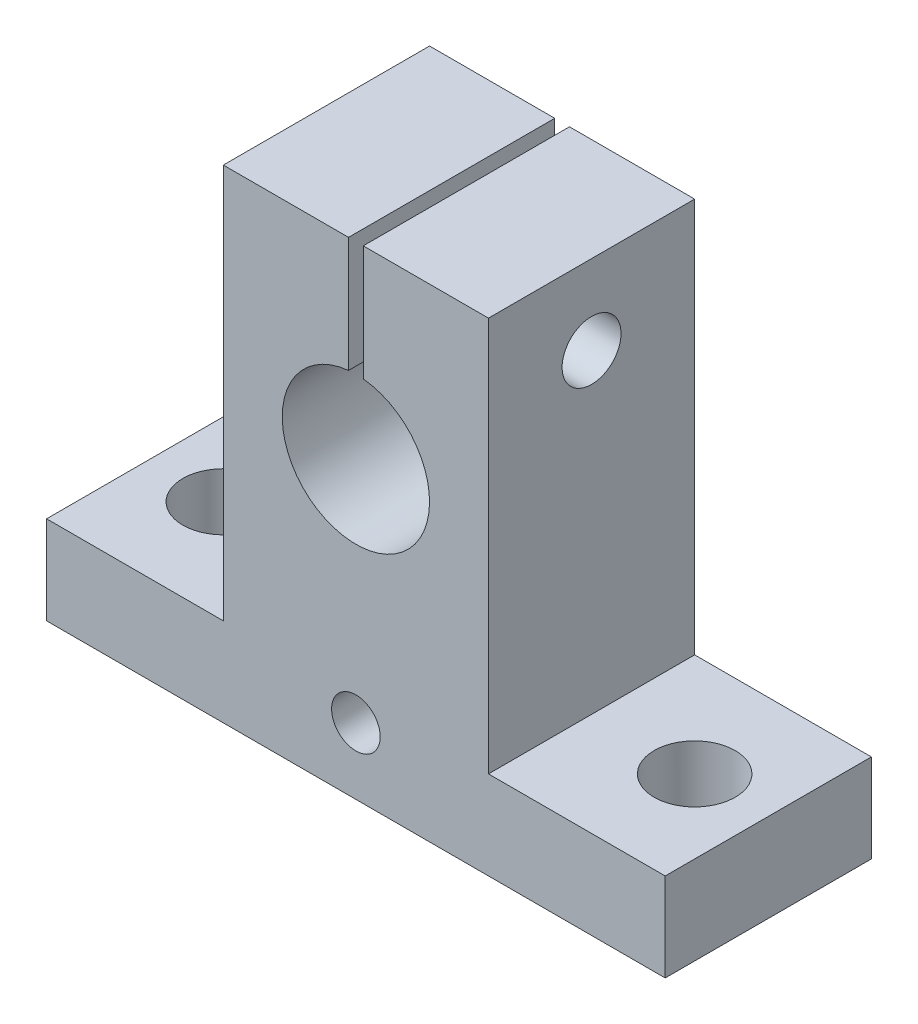
ISO-10303-21;
HEADER;
FILE_DESCRIPTION(('STEP AP214'),'2;1');
FILE_NAME('part.step','',(''),(''),'','','');
FILE_SCHEMA(('AUTOMOTIVE_DESIGN { 1 0 10303 214 1 1 1 1 }'));
ENDSEC;
DATA;
#1=APPLICATION_CONTEXT('core data for automotive mechanical design processes');
#2=APPLICATION_PROTOCOL_DEFINITION('international standard','automotive_design',2000,#1);
#3=PRODUCT_CONTEXT('',#1,'mechanical');
#4=PRODUCT('Part','Part','',(#3));
#5=PRODUCT_RELATED_PRODUCT_CATEGORY('part','',(#4));
#6=PRODUCT_DEFINITION_FORMATION('','',#4);
#7=PRODUCT_DEFINITION_CONTEXT('part definition',#1,'design');
#8=PRODUCT_DEFINITION('design','',#6,#7);
#9=PRODUCT_DEFINITION_SHAPE('','',#8);
#10=(LENGTH_UNIT() NAMED_UNIT(*) SI_UNIT(.MILLI.,.METRE.));
#11=(NAMED_UNIT(*) PLANE_ANGLE_UNIT() SI_UNIT($,.RADIAN.));
#12=(NAMED_UNIT(*) SI_UNIT($,.STERADIAN.) SOLID_ANGLE_UNIT());
#13=UNCERTAINTY_MEASURE_WITH_UNIT(LENGTH_MEASURE(1.E-05),#10,'distance_accuracy_value','');
#14=(GEOMETRIC_REPRESENTATION_CONTEXT(3) GLOBAL_UNCERTAINTY_ASSIGNED_CONTEXT((#13)) GLOBAL_UNIT_ASSIGNED_CONTEXT((#10,
#11,#12)) REPRESENTATION_CONTEXT('',''));
#15=CARTESIAN_POINT('',(0.,0.,0.));
#16=DIRECTION('',(0.,0.,1.));
#17=DIRECTION('',(1.,0.,0.));
#18=AXIS2_PLACEMENT_3D('',#15,#16,#17);
#19=CARTESIAN_POINT('',(-9.,13.4,7.));
#20=DIRECTION('',(0.,-1.,0.));
#21=DIRECTION('',(1.,0.,0.));
#22=AXIS2_PLACEMENT_3D('',#19,#20,#21);
#23=PLANE('',#22);
#24=DIRECTION('',(-1.,0.,0.));
#25=VECTOR('',#24,1.);
#26=CARTESIAN_POINT('',(-9.,13.4,7.));
#27=LINE('',#26,#25);
#28=CARTESIAN_POINT('',(-0.500000000000003,13.4,7.));
#29=VERTEX_POINT('',#28);
#30=CARTESIAN_POINT('',(-9.,13.4,7.));
#31=VERTEX_POINT('',#30);
#32=EDGE_CURVE('E218',#29,#31,#27,.T.);
#33=ORIENTED_EDGE('',*,*,#32,.F.);
#34=DIRECTION('',(0.,0.,-1.));
#35=VECTOR('',#34,1.);
#36=CARTESIAN_POINT('',(-0.500000000000002,13.4,7.));
#37=LINE('',#36,#35);
#38=CARTESIAN_POINT('',(-0.500000000000003,13.4,-7.));
#39=VERTEX_POINT('',#38);
#40=EDGE_CURVE('E133',#29,#39,#37,.T.);
#41=ORIENTED_EDGE('',*,*,#40,.T.);
#42=DIRECTION('',(-1.,0.,0.));
#43=VECTOR('',#42,1.);
#44=CARTESIAN_POINT('',(-9.,13.4,-7.));
#45=LINE('',#44,#43);
#46=CARTESIAN_POINT('',(-9.,13.4,-7.));
#47=VERTEX_POINT('',#46);
#48=EDGE_CURVE('E150',#39,#47,#45,.T.);
#49=ORIENTED_EDGE('',*,*,#48,.T.);
#50=DIRECTION('',(0.,0.,-1.));
#51=VECTOR('',#50,1.);
#52=CARTESIAN_POINT('',(-9.,13.4,7.));
#53=LINE('',#52,#51);
#54=EDGE_CURVE('E182',#31,#47,#53,.T.);
#55=ORIENTED_EDGE('',*,*,#54,.F.);
#56=EDGE_LOOP('',(#33,#41,#49,#55));
#57=FACE_BOUND('',#56,.T.);
#58=ADVANCED_FACE('F38',(#57),#23,.F.);
#59=CARTESIAN_POINT('',(0.,0.,7.));
#60=DIRECTION('',(0.,0.,-1.));
#61=DIRECTION('',(-1.,0.,0.));
#62=AXIS2_PLACEMENT_3D('',#59,#60,#61);
#63=PLANE('',#62);
#64=CARTESIAN_POINT('',(0.,-14.9,7.));
#65=DIRECTION('',(0.,0.,1.));
#66=DIRECTION('',(1.,0.,0.));
#67=AXIS2_PLACEMENT_3D('',#64,#65,#66);
#68=CIRCLE('',#67,1.64999999999999);
#69=CARTESIAN_POINT('',(1.64999999999999,-14.9,7.));
#70=VERTEX_POINT('',#69);
#71=EDGE_CURVE('E280',#70,#70,#68,.T.);
#72=ORIENTED_EDGE('',*,*,#71,.F.);
#73=EDGE_LOOP('',(#72));
#74=FACE_BOUND('',#73,.T.);
#75=CARTESIAN_POINT('',(0.,0.6,7.));
#76=DIRECTION('',(0.,0.,1.));
#77=DIRECTION('',(1.,0.,0.));
#78=AXIS2_PLACEMENT_3D('',#75,#76,#77);
#79=CIRCLE('',#78,5.);
#80=CARTESIAN_POINT('',(-0.500000000000001,5.5749371855331,7.));
#81=VERTEX_POINT('',#80);
#82=CARTESIAN_POINT('',(0.499999999999999,5.5749371855331,7.));
#83=VERTEX_POINT('',#82);
#84=EDGE_CURVE('E202',#81,#83,#79,.T.);
#85=ORIENTED_EDGE('',*,*,#84,.F.);
#86=DIRECTION('',(0.,-1.,0.));
#87=VECTOR('',#86,1.);
#88=CARTESIAN_POINT('',(-0.500000000000004,16.5999271851901,7.));
#89=LINE('',#88,#87);
#90=EDGE_CURVE('E61',#29,#81,#89,.T.);
#91=ORIENTED_EDGE('',*,*,#90,.F.);
#92=ORIENTED_EDGE('',*,*,#32,.T.);
#93=DIRECTION('',(0.,-1.,0.));
#94=VECTOR('',#93,1.);
#95=CARTESIAN_POINT('',(-9.,13.4,7.));
#96=LINE('',#95,#94);
#97=CARTESIAN_POINT('',(-9.,-13.4,7.));
#98=VERTEX_POINT('',#97);
#99=EDGE_CURVE('E220',#31,#98,#96,.T.);
#100=ORIENTED_EDGE('',*,*,#99,.T.);
#101=DIRECTION('',(-1.,0.,0.));
#102=VECTOR('',#101,1.);
#103=CARTESIAN_POINT('',(-9.,-13.4,7.));
#104=LINE('',#103,#102);
#105=CARTESIAN_POINT('',(-21.,-13.4,7.));
#106=VERTEX_POINT('',#105);
#107=EDGE_CURVE('E222',#98,#106,#104,.T.);
#108=ORIENTED_EDGE('',*,*,#107,.T.);
#109=DIRECTION('',(0.,-1.,0.));
#110=VECTOR('',#109,1.);
#111=CARTESIAN_POINT('',(-21.,-13.4,7.));
#112=LINE('',#111,#110);
#113=CARTESIAN_POINT('',(-21.,-19.4,7.));
#114=VERTEX_POINT('',#113);
#115=EDGE_CURVE('E224',#106,#114,#112,.T.);
#116=ORIENTED_EDGE('',*,*,#115,.T.);
#117=DIRECTION('',(1.,0.,0.));
#118=VECTOR('',#117,1.);
#119=CARTESIAN_POINT('',(-21.,-19.4,7.));
#120=LINE('',#119,#118);
#121=CARTESIAN_POINT('',(21.,-19.4,7.));
#122=VERTEX_POINT('',#121);
#123=EDGE_CURVE('E226',#114,#122,#120,.T.);
#124=ORIENTED_EDGE('',*,*,#123,.T.);
#125=DIRECTION('',(0.,1.,0.));
#126=VECTOR('',#125,1.);
#127=CARTESIAN_POINT('',(21.,-13.4,7.));
#128=LINE('',#127,#126);
#129=CARTESIAN_POINT('',(21.,-13.4,7.));
#130=VERTEX_POINT('',#129);
#131=EDGE_CURVE('E170',#122,#130,#128,.T.);
#132=ORIENTED_EDGE('',*,*,#131,.T.);
#133=DIRECTION('',(-1.,0.,0.));
#134=VECTOR('',#133,1.);
#135=CARTESIAN_POINT('',(9.,-13.4,7.));
#136=LINE('',#135,#134);
#137=CARTESIAN_POINT('',(9.,-13.4,7.));
#138=VERTEX_POINT('',#137);
#139=EDGE_CURVE('E165',#130,#138,#136,.T.);
#140=ORIENTED_EDGE('',*,*,#139,.T.);
#141=DIRECTION('',(0.,1.,0.));
#142=VECTOR('',#141,1.);
#143=CARTESIAN_POINT('',(9.,13.4,7.));
#144=LINE('',#143,#142);
#145=CARTESIAN_POINT('',(9.,13.4,7.));
#146=VERTEX_POINT('',#145);
#147=EDGE_CURVE('E216',#138,#146,#144,.T.);
#148=ORIENTED_EDGE('',*,*,#147,.T.);
#149=CARTESIAN_POINT('',(0.499999999999997,13.4,7.));
#150=VERTEX_POINT('',#149);
#151=EDGE_CURVE('E203',#146,#150,#27,.T.);
#152=ORIENTED_EDGE('',*,*,#151,.T.);
#153=DIRECTION('',(0.,1.,0.));
#154=VECTOR('',#153,1.);
#155=CARTESIAN_POINT('',(0.499999999999996,16.5999271851901,7.));
#156=LINE('',#155,#154);
#157=EDGE_CURVE('E128',#83,#150,#156,.T.);
#158=ORIENTED_EDGE('',*,*,#157,.F.);
#159=EDGE_LOOP('',(#85,#91,#92,#100,#108,#116,#124,#132,#140,#148,#152,#158));
#160=FACE_BOUND('',#159,.T.);
#161=ADVANCED_FACE('F201',(#74,#160),#63,.F.);
#162=CARTESIAN_POINT('',(0.,0.,-7.));
#163=DIRECTION('',(0.,0.,-1.));
#164=DIRECTION('',(-1.,0.,0.));
#165=AXIS2_PLACEMENT_3D('',#162,#163,#164);
#166=PLANE('',#165);
#167=CARTESIAN_POINT('',(0.,-14.9,-7.));
#168=DIRECTION('',(0.,0.,1.));
#169=DIRECTION('',(1.,0.,0.));
#170=AXIS2_PLACEMENT_3D('',#167,#168,#169);
#171=CIRCLE('',#170,1.64999999999999);
#172=CARTESIAN_POINT('',(1.64999999999999,-14.9,-7.));
#173=VERTEX_POINT('',#172);
#174=EDGE_CURVE('E277',#173,#173,#171,.T.);
#175=ORIENTED_EDGE('',*,*,#174,.T.);
#176=EDGE_LOOP('',(#175));
#177=FACE_BOUND('',#176,.T.);
#178=DIRECTION('',(0.,-1.,0.));
#179=VECTOR('',#178,1.);
#180=CARTESIAN_POINT('',(-0.500000000000004,16.5999271851901,-7.));
#181=LINE('',#180,#179);
#182=CARTESIAN_POINT('',(-0.500000000000001,5.5749371855331,-7.));
#183=VERTEX_POINT('',#182);
#184=EDGE_CURVE('E143',#39,#183,#181,.T.);
#185=ORIENTED_EDGE('',*,*,#184,.T.);
#186=CARTESIAN_POINT('',(0.,0.6,-7.));
#187=DIRECTION('',(0.,0.,1.));
#188=DIRECTION('',(1.,0.,0.));
#189=AXIS2_PLACEMENT_3D('',#186,#187,#188);
#190=CIRCLE('',#189,5.);
#191=CARTESIAN_POINT('',(0.499999999999999,5.5749371855331,-7.));
#192=VERTEX_POINT('',#191);
#193=EDGE_CURVE('E142',#183,#192,#190,.T.);
#194=ORIENTED_EDGE('',*,*,#193,.T.);
#195=DIRECTION('',(0.,1.,0.));
#196=VECTOR('',#195,1.);
#197=CARTESIAN_POINT('',(0.499999999999996,16.5999271851901,-7.));
#198=LINE('',#197,#196);
#199=CARTESIAN_POINT('',(0.499999999999997,13.4,-7.));
#200=VERTEX_POINT('',#199);
#201=EDGE_CURVE('E54',#192,#200,#198,.T.);
#202=ORIENTED_EDGE('',*,*,#201,.T.);
#203=CARTESIAN_POINT('',(9.,13.4,-7.));
#204=VERTEX_POINT('',#203);
#205=EDGE_CURVE('E140',#204,#200,#45,.T.);
#206=ORIENTED_EDGE('',*,*,#205,.F.);
#207=DIRECTION('',(0.,1.,0.));
#208=VECTOR('',#207,1.);
#209=CARTESIAN_POINT('',(9.,13.4,-7.));
#210=LINE('',#209,#208);
#211=CARTESIAN_POINT('',(9.,-13.4,-7.));
#212=VERTEX_POINT('',#211);
#213=EDGE_CURVE('E154',#212,#204,#210,.T.);
#214=ORIENTED_EDGE('',*,*,#213,.F.);
#215=DIRECTION('',(-1.,0.,0.));
#216=VECTOR('',#215,1.);
#217=CARTESIAN_POINT('',(9.,-13.4,-7.));
#218=LINE('',#217,#216);
#219=CARTESIAN_POINT('',(21.,-13.4,-7.));
#220=VERTEX_POINT('',#219);
#221=EDGE_CURVE('E207',#220,#212,#218,.T.);
#222=ORIENTED_EDGE('',*,*,#221,.F.);
#223=DIRECTION('',(0.,1.,0.));
#224=VECTOR('',#223,1.);
#225=CARTESIAN_POINT('',(21.,-13.4,-7.));
#226=LINE('',#225,#224);
#227=CARTESIAN_POINT('',(21.,-19.4,-7.));
#228=VERTEX_POINT('',#227);
#229=EDGE_CURVE('E163',#228,#220,#226,.T.);
#230=ORIENTED_EDGE('',*,*,#229,.F.);
#231=DIRECTION('',(1.,0.,0.));
#232=VECTOR('',#231,1.);
#233=CARTESIAN_POINT('',(-21.,-19.4,-7.));
#234=LINE('',#233,#232);
#235=CARTESIAN_POINT('',(-21.,-19.4,-7.));
#236=VERTEX_POINT('',#235);
#237=EDGE_CURVE('E161',#236,#228,#234,.T.);
#238=ORIENTED_EDGE('',*,*,#237,.F.);
#239=DIRECTION('',(0.,-1.,0.));
#240=VECTOR('',#239,1.);
#241=CARTESIAN_POINT('',(-21.,-13.4,-7.));
#242=LINE('',#241,#240);
#243=CARTESIAN_POINT('',(-21.,-13.4,-7.));
#244=VERTEX_POINT('',#243);
#245=EDGE_CURVE('E159',#244,#236,#242,.T.);
#246=ORIENTED_EDGE('',*,*,#245,.F.);
#247=DIRECTION('',(-1.,0.,0.));
#248=VECTOR('',#247,1.);
#249=CARTESIAN_POINT('',(-9.,-13.4,-7.));
#250=LINE('',#249,#248);
#251=CARTESIAN_POINT('',(-9.,-13.4,-7.));
#252=VERTEX_POINT('',#251);
#253=EDGE_CURVE('E152',#252,#244,#250,.T.);
#254=ORIENTED_EDGE('',*,*,#253,.F.);
#255=DIRECTION('',(0.,-1.,0.));
#256=VECTOR('',#255,1.);
#257=CARTESIAN_POINT('',(-9.,13.4,-7.));
#258=LINE('',#257,#256);
#259=EDGE_CURVE('E149',#47,#252,#258,.T.);
#260=ORIENTED_EDGE('',*,*,#259,.F.);
#261=ORIENTED_EDGE('',*,*,#48,.F.);
#262=EDGE_LOOP('',(#185,#194,#202,#206,#214,#222,#230,#238,#246,#254,#260,#261));
#263=FACE_BOUND('',#262,.T.);
#264=ADVANCED_FACE('F139',(#177,#263),#166,.T.);
#265=CARTESIAN_POINT('',(9.,-13.4,7.));
#266=DIRECTION('',(0.,-1.,0.));
#267=DIRECTION('',(1.,0.,0.));
#268=AXIS2_PLACEMENT_3D('',#265,#266,#267);
#269=PLANE('',#268);
#270=CARTESIAN_POINT('',(16.,-13.4,0.));
#271=DIRECTION('',(0.,1.,0.));
#272=DIRECTION('',(0.,0.,-1.));
#273=AXIS2_PLACEMENT_3D('',#270,#271,#272);
#274=CIRCLE('',#273,2.75);
#275=CARTESIAN_POINT('',(16.,-13.4,-2.75));
#276=VERTEX_POINT('',#275);
#277=EDGE_CURVE('E196',#276,#276,#274,.T.);
#278=ORIENTED_EDGE('',*,*,#277,.F.);
#279=EDGE_LOOP('',(#278));
#280=FACE_BOUND('',#279,.T.);
#281=ORIENTED_EDGE('',*,*,#221,.T.);
#282=DIRECTION('',(0.,0.,-1.));
#283=VECTOR('',#282,1.);
#284=CARTESIAN_POINT('',(9.,-13.4,7.));
#285=LINE('',#284,#283);
#286=EDGE_CURVE('E186',#138,#212,#285,.T.);
#287=ORIENTED_EDGE('',*,*,#286,.F.);
#288=ORIENTED_EDGE('',*,*,#139,.F.);
#289=DIRECTION('',(0.,0.,-1.));
#290=VECTOR('',#289,1.);
#291=CARTESIAN_POINT('',(21.,-13.4,7.));
#292=LINE('',#291,#290);
#293=EDGE_CURVE('E166',#130,#220,#292,.T.);
#294=ORIENTED_EDGE('',*,*,#293,.T.);
#295=EDGE_LOOP('',(#281,#287,#288,#294));
#296=FACE_BOUND('',#295,.T.);
#297=ADVANCED_FACE('F40',(#280,#296),#269,.F.);
#298=CARTESIAN_POINT('',(9.,13.4,7.));
#299=DIRECTION('',(-1.,0.,0.));
#300=DIRECTION('',(0.,-1.,0.));
#301=AXIS2_PLACEMENT_3D('',#298,#299,#300);
#302=PLANE('',#301);
#303=CARTESIAN_POINT('',(9.,8.,0.));
#304=DIRECTION('',(1.,0.,0.));
#305=DIRECTION('',(0.,1.,0.));
#306=AXIS2_PLACEMENT_3D('',#303,#304,#305);
#307=CIRCLE('',#306,2.);
#308=CARTESIAN_POINT('',(9.,10.,0.));
#309=VERTEX_POINT('',#308);
#310=EDGE_CURVE('E274',#309,#309,#307,.T.);
#311=ORIENTED_EDGE('',*,*,#310,.F.);
#312=EDGE_LOOP('',(#311));
#313=FACE_BOUND('',#312,.T.);
#314=ORIENTED_EDGE('',*,*,#213,.T.);
#315=DIRECTION('',(0.,0.,-1.));
#316=VECTOR('',#315,1.);
#317=CARTESIAN_POINT('',(9.,13.4,7.));
#318=LINE('',#317,#316);
#319=EDGE_CURVE('E148',#146,#204,#318,.T.);
#320=ORIENTED_EDGE('',*,*,#319,.F.);
#321=ORIENTED_EDGE('',*,*,#147,.F.);
#322=ORIENTED_EDGE('',*,*,#286,.T.);
#323=EDGE_LOOP('',(#314,#320,#321,#322));
#324=FACE_BOUND('',#323,.T.);
#325=ADVANCED_FACE('F240',(#313,#324),#302,.F.);
#326=ORIENTED_EDGE('',*,*,#205,.T.);
#327=DIRECTION('',(0.,0.,1.));
#328=VECTOR('',#327,1.);
#329=CARTESIAN_POINT('',(0.499999999999997,13.4,7.));
#330=LINE('',#329,#328);
#331=EDGE_CURVE('E125',#200,#150,#330,.T.);
#332=ORIENTED_EDGE('',*,*,#331,.T.);
#333=ORIENTED_EDGE('',*,*,#151,.F.);
#334=ORIENTED_EDGE('',*,*,#319,.T.);
#335=EDGE_LOOP('',(#326,#332,#333,#334));
#336=FACE_BOUND('',#335,.T.);
#337=ADVANCED_FACE('F146',(#336),#23,.F.);
#338=CARTESIAN_POINT('',(-9.,13.4,7.));
#339=DIRECTION('',(1.,0.,0.));
#340=DIRECTION('',(0.,1.,0.));
#341=AXIS2_PLACEMENT_3D('',#338,#339,#340);
#342=PLANE('',#341);
#343=CARTESIAN_POINT('',(-9.,8.,0.));
#344=DIRECTION('',(1.,0.,0.));
#345=DIRECTION('',(0.,1.,0.));
#346=AXIS2_PLACEMENT_3D('',#343,#344,#345);
#347=CIRCLE('',#346,2.);
#348=CARTESIAN_POINT('',(-9.,10.,0.));
#349=VERTEX_POINT('',#348);
#350=EDGE_CURVE('E204',#349,#349,#347,.T.);
#351=ORIENTED_EDGE('',*,*,#350,.T.);
#352=EDGE_LOOP('',(#351));
#353=FACE_BOUND('',#352,.T.);
#354=ORIENTED_EDGE('',*,*,#259,.T.);
#355=DIRECTION('',(0.,0.,-1.));
#356=VECTOR('',#355,1.);
#357=CARTESIAN_POINT('',(-9.,-13.4,7.));
#358=LINE('',#357,#356);
#359=EDGE_CURVE('E179',#98,#252,#358,.T.);
#360=ORIENTED_EDGE('',*,*,#359,.F.);
#361=ORIENTED_EDGE('',*,*,#99,.F.);
#362=ORIENTED_EDGE('',*,*,#54,.T.);
#363=EDGE_LOOP('',(#354,#360,#361,#362));
#364=FACE_BOUND('',#363,.T.);
#365=ADVANCED_FACE('F258',(#353,#364),#342,.F.);
#366=CARTESIAN_POINT('',(-9.,-13.4,7.));
#367=DIRECTION('',(0.,-1.,0.));
#368=DIRECTION('',(1.,0.,0.));
#369=AXIS2_PLACEMENT_3D('',#366,#367,#368);
#370=PLANE('',#369);
#371=CARTESIAN_POINT('',(-16.,-13.4,0.));
#372=DIRECTION('',(0.,1.,0.));
#373=DIRECTION('',(0.,0.,1.));
#374=AXIS2_PLACEMENT_3D('',#371,#372,#373);
#375=CIRCLE('',#374,2.75);
#376=CARTESIAN_POINT('',(-16.,-13.4,2.75));
#377=VERTEX_POINT('',#376);
#378=EDGE_CURVE('E192',#377,#377,#375,.T.);
#379=ORIENTED_EDGE('',*,*,#378,.F.);
#380=EDGE_LOOP('',(#379));
#381=FACE_BOUND('',#380,.T.);
#382=ORIENTED_EDGE('',*,*,#253,.T.);
#383=DIRECTION('',(0.,0.,-1.));
#384=VECTOR('',#383,1.);
#385=CARTESIAN_POINT('',(-21.,-13.4,7.));
#386=LINE('',#385,#384);
#387=EDGE_CURVE('E176',#106,#244,#386,.T.);
#388=ORIENTED_EDGE('',*,*,#387,.F.);
#389=ORIENTED_EDGE('',*,*,#107,.F.);
#390=ORIENTED_EDGE('',*,*,#359,.T.);
#391=EDGE_LOOP('',(#382,#388,#389,#390));
#392=FACE_BOUND('',#391,.T.);
#393=ADVANCED_FACE('F253',(#381,#392),#370,.F.);
#394=CARTESIAN_POINT('',(-21.,-13.4,7.));
#395=DIRECTION('',(1.,0.,0.));
#396=DIRECTION('',(0.,1.,0.));
#397=AXIS2_PLACEMENT_3D('',#394,#395,#396);
#398=PLANE('',#397);
#399=ORIENTED_EDGE('',*,*,#245,.T.);
#400=DIRECTION('',(0.,0.,-1.));
#401=VECTOR('',#400,1.);
#402=CARTESIAN_POINT('',(-21.,-19.4,7.));
#403=LINE('',#402,#401);
#404=EDGE_CURVE('E173',#114,#236,#403,.T.);
#405=ORIENTED_EDGE('',*,*,#404,.F.);
#406=ORIENTED_EDGE('',*,*,#115,.F.);
#407=ORIENTED_EDGE('',*,*,#387,.T.);
#408=EDGE_LOOP('',(#399,#405,#406,#407));
#409=FACE_BOUND('',#408,.T.);
#410=ADVANCED_FACE('F249',(#409),#398,.F.);
#411=CARTESIAN_POINT('',(-21.,-19.4,7.));
#412=DIRECTION('',(0.,1.,0.));
#413=DIRECTION('',(-1.,0.,0.));
#414=AXIS2_PLACEMENT_3D('',#411,#412,#413);
#415=PLANE('',#414);
#416=CARTESIAN_POINT('',(16.,-19.4,0.));
#417=DIRECTION('',(0.,1.,0.));
#418=DIRECTION('',(-1.,0.,0.));
#419=AXIS2_PLACEMENT_3D('',#416,#417,#418);
#420=CIRCLE('',#419,2.75);
#421=CARTESIAN_POINT('',(13.25,-19.4,0.));
#422=VERTEX_POINT('',#421);
#423=EDGE_CURVE('E193',#422,#422,#420,.T.);
#424=ORIENTED_EDGE('',*,*,#423,.T.);
#425=EDGE_LOOP('',(#424));
#426=FACE_BOUND('',#425,.T.);
#427=CARTESIAN_POINT('',(-16.,-19.4,0.));
#428=DIRECTION('',(0.,1.,0.));
#429=DIRECTION('',(-1.,0.,0.));
#430=AXIS2_PLACEMENT_3D('',#427,#428,#429);
#431=CIRCLE('',#430,2.75);
#432=CARTESIAN_POINT('',(-18.75,-19.4,0.));
#433=VERTEX_POINT('',#432);
#434=EDGE_CURVE('E189',#433,#433,#431,.T.);
#435=ORIENTED_EDGE('',*,*,#434,.T.);
#436=EDGE_LOOP('',(#435));
#437=FACE_BOUND('',#436,.T.);
#438=ORIENTED_EDGE('',*,*,#237,.T.);
#439=DIRECTION('',(0.,0.,-1.));
#440=VECTOR('',#439,1.);
#441=CARTESIAN_POINT('',(21.,-19.4,7.));
#442=LINE('',#441,#440);
#443=EDGE_CURVE('E169',#122,#228,#442,.T.);
#444=ORIENTED_EDGE('',*,*,#443,.F.);
#445=ORIENTED_EDGE('',*,*,#123,.F.);
#446=ORIENTED_EDGE('',*,*,#404,.T.);
#447=EDGE_LOOP('',(#438,#444,#445,#446));
#448=FACE_BOUND('',#447,.T.);
#449=ADVANCED_FACE('F245',(#426,#437,#448),#415,.F.);
#450=CARTESIAN_POINT('',(21.,-13.4,7.));
#451=DIRECTION('',(-1.,0.,0.));
#452=DIRECTION('',(0.,-1.,0.));
#453=AXIS2_PLACEMENT_3D('',#450,#451,#452);
#454=PLANE('',#453);
#455=ORIENTED_EDGE('',*,*,#229,.T.);
#456=ORIENTED_EDGE('',*,*,#293,.F.);
#457=ORIENTED_EDGE('',*,*,#131,.F.);
#458=ORIENTED_EDGE('',*,*,#443,.T.);
#459=EDGE_LOOP('',(#455,#456,#457,#458));
#460=FACE_BOUND('',#459,.T.);
#461=ADVANCED_FACE('F235',(#460),#454,.F.);
#462=CARTESIAN_POINT('',(0.,0.6,7.));
#463=DIRECTION('',(0.,0.,-1.));
#464=DIRECTION('',(-1.,0.,0.));
#465=AXIS2_PLACEMENT_3D('',#462,#463,#464);
#466=CYLINDRICAL_SURFACE('',#465,5.);
#467=DIRECTION('',(0.,0.,-1.));
#468=VECTOR('',#467,1.);
#469=CARTESIAN_POINT('',(-0.500000000000001,5.5749371855331,7.));
#470=LINE('',#469,#468);
#471=EDGE_CURVE('E11',#81,#183,#470,.T.);
#472=ORIENTED_EDGE('',*,*,#471,.F.);
#473=ORIENTED_EDGE('',*,*,#84,.T.);
#474=DIRECTION('',(0.,0.,-1.));
#475=VECTOR('',#474,1.);
#476=CARTESIAN_POINT('',(0.499999999999999,5.5749371855331,7.));
#477=LINE('',#476,#475);
#478=EDGE_CURVE('E47',#192,#83,#477,.F.);
#479=ORIENTED_EDGE('',*,*,#478,.F.);
#480=ORIENTED_EDGE('',*,*,#193,.F.);
#481=EDGE_LOOP('',(#472,#473,#479,#480));
#482=FACE_BOUND('',#481,.T.);
#483=ADVANCED_FACE('F206',(#482),#466,.F.);
#484=CARTESIAN_POINT('',(-16.,-23.4,0.));
#485=DIRECTION('',(0.,1.,0.));
#486=DIRECTION('',(0.,0.,1.));
#487=AXIS2_PLACEMENT_3D('',#484,#485,#486);
#488=CYLINDRICAL_SURFACE('',#487,2.75);
#489=ORIENTED_EDGE('',*,*,#378,.T.);
#490=EDGE_LOOP('',(#489));
#491=FACE_BOUND('',#490,.T.);
#492=ORIENTED_EDGE('',*,*,#434,.F.);
#493=EDGE_LOOP('',(#492));
#494=FACE_BOUND('',#493,.T.);
#495=ADVANCED_FACE('F336',(#491,#494),#488,.F.);
#496=CARTESIAN_POINT('',(16.,-23.4,0.));
#497=DIRECTION('',(0.,1.,0.));
#498=DIRECTION('',(0.,0.,1.));
#499=AXIS2_PLACEMENT_3D('',#496,#497,#498);
#500=CYLINDRICAL_SURFACE('',#499,2.75);
#501=ORIENTED_EDGE('',*,*,#277,.T.);
#502=EDGE_LOOP('',(#501));
#503=FACE_BOUND('',#502,.T.);
#504=ORIENTED_EDGE('',*,*,#423,.F.);
#505=EDGE_LOOP('',(#504));
#506=FACE_BOUND('',#505,.T.);
#507=ADVANCED_FACE('F328',(#503,#506),#500,.F.);
#508=CARTESIAN_POINT('',(0.499999999999996,16.5999271851901,-20.1778548882616));
#509=DIRECTION('',(1.,0.,0.));
#510=DIRECTION('',(0.,1.,0.));
#511=AXIS2_PLACEMENT_3D('',#508,#509,#510);
#512=PLANE('',#511);
#513=CARTESIAN_POINT('',(0.5,8.,0.));
#514=DIRECTION('',(1.,0.,0.));
#515=DIRECTION('',(0.,1.,0.));
#516=AXIS2_PLACEMENT_3D('',#513,#514,#515);
#517=CIRCLE('',#516,2.);
#518=CARTESIAN_POINT('',(0.5,10.,0.));
#519=VERTEX_POINT('',#518);
#520=EDGE_CURVE('E271',#519,#519,#517,.T.);
#521=ORIENTED_EDGE('',*,*,#520,.T.);
#522=EDGE_LOOP('',(#521));
#523=FACE_BOUND('',#522,.T.);
#524=ORIENTED_EDGE('',*,*,#201,.F.);
#525=ORIENTED_EDGE('',*,*,#478,.T.);
#526=ORIENTED_EDGE('',*,*,#157,.T.);
#527=ORIENTED_EDGE('',*,*,#331,.F.);
#528=EDGE_LOOP('',(#524,#525,#526,#527));
#529=FACE_BOUND('',#528,.T.);
#530=ADVANCED_FACE('F126',(#523,#529),#512,.F.);
#531=CARTESIAN_POINT('',(-0.500000000000004,16.5999271851901,-20.1778548882616));
#532=DIRECTION('',(-1.,0.,0.));
#533=DIRECTION('',(0.,-1.,0.));
#534=AXIS2_PLACEMENT_3D('',#531,#532,#533);
#535=PLANE('',#534);
#536=CARTESIAN_POINT('',(-0.5,8.,0.));
#537=DIRECTION('',(-1.,0.,0.));
#538=DIRECTION('',(0.,-1.,0.));
#539=AXIS2_PLACEMENT_3D('',#536,#537,#538);
#540=CIRCLE('',#539,2.);
#541=CARTESIAN_POINT('',(-0.5,6.,0.));
#542=VERTEX_POINT('',#541);
#543=EDGE_CURVE('E42',#542,#542,#540,.T.);
#544=ORIENTED_EDGE('',*,*,#543,.T.);
#545=EDGE_LOOP('',(#544));
#546=FACE_BOUND('',#545,.T.);
#547=ORIENTED_EDGE('',*,*,#90,.T.);
#548=ORIENTED_EDGE('',*,*,#471,.T.);
#549=ORIENTED_EDGE('',*,*,#184,.F.);
#550=ORIENTED_EDGE('',*,*,#40,.F.);
#551=EDGE_LOOP('',(#547,#548,#549,#550));
#552=FACE_BOUND('',#551,.T.);
#553=ADVANCED_FACE('F327',(#546,#552),#535,.F.);
#554=CARTESIAN_POINT('',(-21.,8.,0.));
#555=DIRECTION('',(1.,0.,0.));
#556=DIRECTION('',(0.,1.,0.));
#557=AXIS2_PLACEMENT_3D('',#554,#555,#556);
#558=CYLINDRICAL_SURFACE('',#557,2.);
#559=ORIENTED_EDGE('',*,*,#543,.F.);
#560=EDGE_LOOP('',(#559));
#561=FACE_BOUND('',#560,.T.);
#562=ORIENTED_EDGE('',*,*,#350,.F.);
#563=EDGE_LOOP('',(#562));
#564=FACE_BOUND('',#563,.T.);
#565=ADVANCED_FACE('F322',(#561,#564),#558,.F.);
#566=ORIENTED_EDGE('',*,*,#310,.T.);
#567=EDGE_LOOP('',(#566));
#568=FACE_BOUND('',#567,.T.);
#569=ORIENTED_EDGE('',*,*,#520,.F.);
#570=EDGE_LOOP('',(#569));
#571=FACE_BOUND('',#570,.T.);
#572=ADVANCED_FACE('F319',(#568,#571),#558,.F.);
#573=CARTESIAN_POINT('',(0.,-14.9,7.));
#574=DIRECTION('',(0.,0.,1.));
#575=DIRECTION('',(1.,0.,0.));
#576=AXIS2_PLACEMENT_3D('',#573,#574,#575);
#577=CYLINDRICAL_SURFACE('',#576,1.64999999999999);
#578=ORIENTED_EDGE('',*,*,#174,.F.);
#579=EDGE_LOOP('',(#578));
#580=FACE_BOUND('',#579,.T.);
#581=ORIENTED_EDGE('',*,*,#71,.T.);
#582=EDGE_LOOP('',(#581));
#583=FACE_BOUND('',#582,.T.);
#584=ADVANCED_FACE('F284',(#580,#583),#577,.F.);
#585=CLOSED_SHELL('',(#58,#161,#264,#297,#325,#337,#365,#393,#410,#449,#461,#483,#495,#507,#530,
#553,#565,#572,#584));
#586=MANIFOLD_SOLID_BREP('B2',#585);
#587=ADVANCED_BREP_SHAPE_REPRESENTATION('',(#18,#586),#14);
#588=SHAPE_DEFINITION_REPRESENTATION(#9,#587);
ENDSEC;
END-ISO-10303-21;
